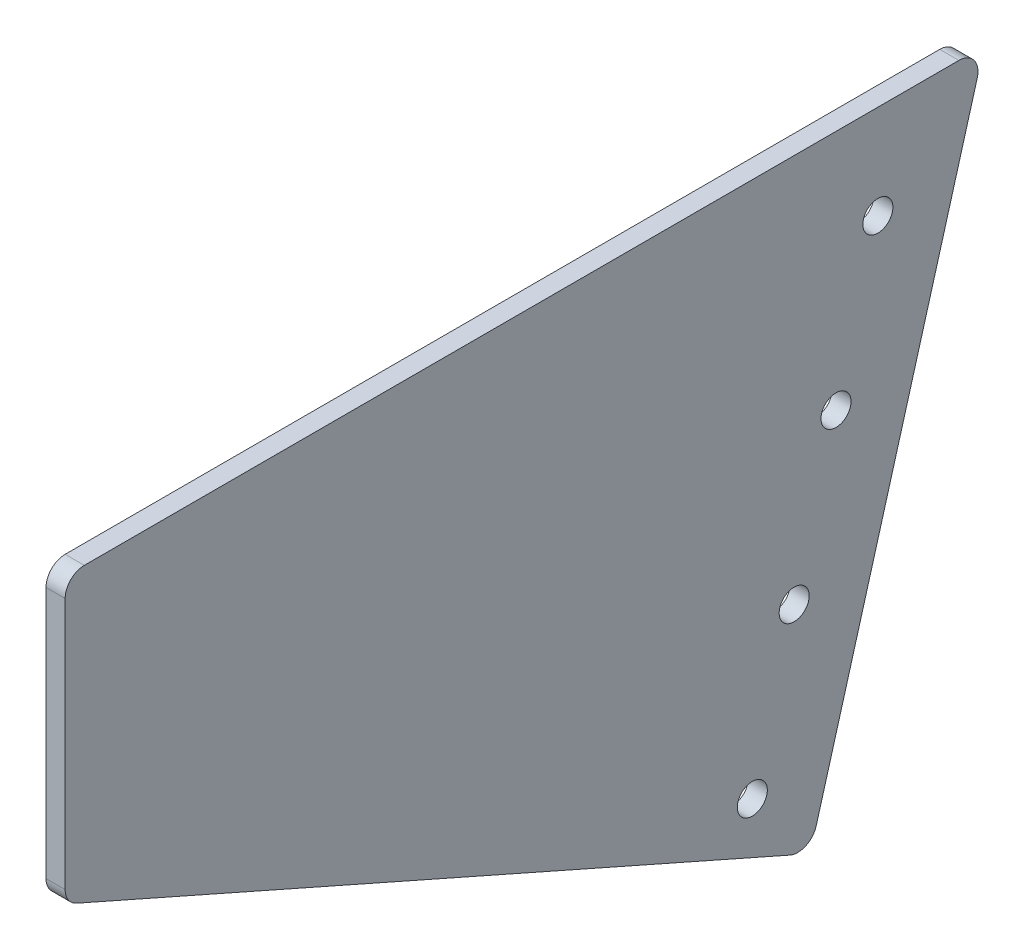
ISO-10303-21;
HEADER;
FILE_DESCRIPTION(('STEP AP214'),'2;1');
FILE_NAME('part.step','',(''),(''),'','','');
FILE_SCHEMA(('AUTOMOTIVE_DESIGN { 1 0 10303 214 1 1 1 1 }'));
ENDSEC;
DATA;
#1=APPLICATION_CONTEXT('core data for automotive mechanical design processes');
#2=APPLICATION_PROTOCOL_DEFINITION('international standard','automotive_design',2000,#1);
#3=PRODUCT_CONTEXT('',#1,'mechanical');
#4=PRODUCT('Part','Part','',(#3));
#5=PRODUCT_RELATED_PRODUCT_CATEGORY('part','',(#4));
#6=PRODUCT_DEFINITION_FORMATION('','',#4);
#7=PRODUCT_DEFINITION_CONTEXT('part definition',#1,'design');
#8=PRODUCT_DEFINITION('design','',#6,#7);
#9=PRODUCT_DEFINITION_SHAPE('','',#8);
#10=(LENGTH_UNIT() NAMED_UNIT(*) SI_UNIT(.MILLI.,.METRE.));
#11=(NAMED_UNIT(*) PLANE_ANGLE_UNIT() SI_UNIT($,.RADIAN.));
#12=(NAMED_UNIT(*) SI_UNIT($,.STERADIAN.) SOLID_ANGLE_UNIT());
#13=UNCERTAINTY_MEASURE_WITH_UNIT(LENGTH_MEASURE(1.E-05),#10,'distance_accuracy_value','');
#14=(GEOMETRIC_REPRESENTATION_CONTEXT(3) GLOBAL_UNCERTAINTY_ASSIGNED_CONTEXT((#13)) GLOBAL_UNIT_ASSIGNED_CONTEXT((#10,
#11,#12)) REPRESENTATION_CONTEXT('',''));
#15=CARTESIAN_POINT('',(0.,0.,0.));
#16=DIRECTION('',(0.,0.,1.));
#17=DIRECTION('',(1.,0.,0.));
#18=AXIS2_PLACEMENT_3D('',#15,#16,#17);
#19=CARTESIAN_POINT('',(3.175,0.,0.));
#20=DIRECTION('',(-1.,0.,0.));
#21=DIRECTION('',(0.,0.,1.));
#22=AXIS2_PLACEMENT_3D('',#19,#20,#21);
#23=PLANE('',#22);
#24=DIRECTION('',(0.,-0.403945829046919,-0.914782907140048));
#25=VECTOR('',#24,1.);
#26=CARTESIAN_POINT('',(3.175,252.697139878988,256.767993009252));
#27=LINE('',#26,#25);
#28=CARTESIAN_POINT('',(3.175,251.861470386146,254.875521016476));
#29=VERTEX_POINT('',#28);
#30=CARTESIAN_POINT('',(3.175,199.617122937856,136.562042812866));
#31=VERTEX_POINT('',#30);
#32=EDGE_CURVE('E144',#29,#31,#27,.T.);
#33=ORIENTED_EDGE('',*,*,#32,.T.);
#34=CARTESIAN_POINT('',(3.175,202.521558668026,135.279514805642));
#35=DIRECTION('',(-1.,0.,0.));
#36=DIRECTION('',(0.,0.,1.));
#37=AXIS2_PLACEMENT_3D('',#34,#35,#36);
#38=CIRCLE('',#37,3.175);
#39=CARTESIAN_POINT('',(3.175,201.654154713459,132.225298804833));
#40=VERTEX_POINT('',#39);
#41=EDGE_CURVE('E162',#31,#40,#38,.F.);
#42=ORIENTED_EDGE('',*,*,#41,.T.);
#43=DIRECTION('',(0.,0.96195779553062,-0.273198095926508));
#44=VECTOR('',#43,1.);
#45=CARTESIAN_POINT('',(3.175,198.142512107239,133.222612905359));
#46=LINE('',#45,#44);
#47=CARTESIAN_POINT('',(3.175,295.700108152673,105.516044481452));
#48=VERTEX_POINT('',#47);
#49=EDGE_CURVE('E126',#40,#48,#46,.T.);
#50=ORIENTED_EDGE('',*,*,#49,.T.);
#51=CARTESIAN_POINT('',(3.175,296.567512107239,108.570260482261));
#52=DIRECTION('',(-1.,0.,0.));
#53=DIRECTION('',(0.,0.,1.));
#54=AXIS2_PLACEMENT_3D('',#51,#52,#53);
#55=CIRCLE('',#54,3.175);
#56=CARTESIAN_POINT('',(3.175,299.742512107239,108.570260482261));
#57=VERTEX_POINT('',#56);
#58=EDGE_CURVE('E158',#48,#57,#55,.F.);
#59=ORIENTED_EDGE('',*,*,#58,.T.);
#60=DIRECTION('',(0.,0.,1.));
#61=VECTOR('',#60,1.);
#62=CARTESIAN_POINT('',(3.175,299.742512107239,104.367993009252));
#63=LINE('',#62,#61);
#64=CARTESIAN_POINT('',(3.175,299.742512107239,253.592993009252));
#65=VERTEX_POINT('',#64);
#66=EDGE_CURVE('E171',#57,#65,#63,.T.);
#67=ORIENTED_EDGE('',*,*,#66,.T.);
#68=CARTESIAN_POINT('',(3.175,296.567512107239,253.592993009252));
#69=DIRECTION('',(-1.,0.,0.));
#70=DIRECTION('',(0.,0.,1.));
#71=AXIS2_PLACEMENT_3D('',#68,#69,#70);
#72=CIRCLE('',#71,3.175);
#73=CARTESIAN_POINT('',(3.175,296.567512107239,256.767993009252));
#74=VERTEX_POINT('',#73);
#75=EDGE_CURVE('E61',#65,#74,#72,.F.);
#76=ORIENTED_EDGE('',*,*,#75,.T.);
#77=DIRECTION('',(0.,-1.,0.));
#78=VECTOR('',#77,1.);
#79=CARTESIAN_POINT('',(3.175,299.742512107239,256.767993009252));
#80=LINE('',#79,#78);
#81=CARTESIAN_POINT('',(3.175,254.765906116316,256.767993009252));
#82=VERTEX_POINT('',#81);
#83=EDGE_CURVE('E177',#74,#82,#80,.T.);
#84=ORIENTED_EDGE('',*,*,#83,.T.);
#85=CARTESIAN_POINT('',(3.175,254.765906116316,253.592993009252));
#86=DIRECTION('',(-1.,0.,0.));
#87=DIRECTION('',(0.,0.,1.));
#88=AXIS2_PLACEMENT_3D('',#85,#86,#87);
#89=CIRCLE('',#88,3.175);
#90=EDGE_CURVE('E160',#82,#29,#89,.F.);
#91=ORIENTED_EDGE('',*,*,#90,.T.);
#92=EDGE_LOOP('',(#33,#42,#50,#59,#67,#76,#84,#91));
#93=FACE_BOUND('',#92,.T.);
#94=CARTESIAN_POINT('',(3.175,284.143696126672,122.000332913772));
#95=DIRECTION('',(1.,0.,0.));
#96=DIRECTION('',(0.,0.,-1.));
#97=AXIS2_PLACEMENT_3D('',#94,#95,#96);
#98=CIRCLE('',#97,2.48920000000006);
#99=CARTESIAN_POINT('',(3.175,284.143696126672,119.511132913772));
#100=VERTEX_POINT('',#99);
#101=EDGE_CURVE('E135',#100,#100,#98,.T.);
#102=ORIENTED_EDGE('',*,*,#101,.F.);
#103=EDGE_LOOP('',(#102));
#104=FACE_BOUND('',#103,.T.);
#105=CARTESIAN_POINT('',(3.175,259.709968120195,128.939564550305));
#106=DIRECTION('',(1.,0.,0.));
#107=DIRECTION('',(0.,0.,-1.));
#108=AXIS2_PLACEMENT_3D('',#105,#106,#107);
#109=CIRCLE('',#108,2.48920000000009);
#110=CARTESIAN_POINT('',(3.175,259.709968120195,126.450364550305));
#111=VERTEX_POINT('',#110);
#112=EDGE_CURVE('E192',#111,#111,#109,.T.);
#113=ORIENTED_EDGE('',*,*,#112,.F.);
#114=EDGE_LOOP('',(#113));
#115=FACE_BOUND('',#114,.T.);
#116=CARTESIAN_POINT('',(3.175,235.276240113717,135.878796186838));
#117=DIRECTION('',(1.,0.,0.));
#118=DIRECTION('',(0.,0.,-1.));
#119=AXIS2_PLACEMENT_3D('',#116,#117,#118);
#120=CIRCLE('',#119,2.48920000000009);
#121=CARTESIAN_POINT('',(3.175,235.276240113717,133.389596186838));
#122=VERTEX_POINT('',#121);
#123=EDGE_CURVE('E197',#122,#122,#120,.T.);
#124=ORIENTED_EDGE('',*,*,#123,.F.);
#125=EDGE_LOOP('',(#124));
#126=FACE_BOUND('',#125,.T.);
#127=CARTESIAN_POINT('',(3.175,210.842512107239,142.818027823372));
#128=DIRECTION('',(1.,0.,0.));
#129=DIRECTION('',(0.,0.,-1.));
#130=AXIS2_PLACEMENT_3D('',#127,#128,#129);
#131=CIRCLE('',#130,2.48920000000006);
#132=CARTESIAN_POINT('',(3.175,210.842512107239,140.328827823372));
#133=VERTEX_POINT('',#132);
#134=EDGE_CURVE('E203',#133,#133,#131,.T.);
#135=ORIENTED_EDGE('',*,*,#134,.F.);
#136=EDGE_LOOP('',(#135));
#137=FACE_BOUND('',#136,.T.);
#138=ADVANCED_FACE('F39',(#93,#104,#115,#126,#137),#23,.F.);
#139=CARTESIAN_POINT('',(0.,0.,0.));
#140=DIRECTION('',(-1.,0.,0.));
#141=DIRECTION('',(0.,0.,1.));
#142=AXIS2_PLACEMENT_3D('',#139,#140,#141);
#143=PLANE('',#142);
#144=CARTESIAN_POINT('',(0.,235.276240113717,135.878796186838));
#145=DIRECTION('',(1.,0.,0.));
#146=DIRECTION('',(0.,0.,-1.));
#147=AXIS2_PLACEMENT_3D('',#144,#145,#146);
#148=CIRCLE('',#147,2.48920000000009);
#149=CARTESIAN_POINT('',(0.,235.276240113717,133.389596186838));
#150=VERTEX_POINT('',#149);
#151=EDGE_CURVE('E200',#150,#150,#148,.T.);
#152=ORIENTED_EDGE('',*,*,#151,.T.);
#153=EDGE_LOOP('',(#152));
#154=FACE_BOUND('',#153,.T.);
#155=CARTESIAN_POINT('',(0.,284.143696126672,122.000332913772));
#156=DIRECTION('',(1.,0.,0.));
#157=DIRECTION('',(0.,0.,-1.));
#158=AXIS2_PLACEMENT_3D('',#155,#156,#157);
#159=CIRCLE('',#158,2.48920000000006);
#160=CARTESIAN_POINT('',(0.,284.143696126672,119.511132913772));
#161=VERTEX_POINT('',#160);
#162=EDGE_CURVE('E141',#161,#161,#159,.T.);
#163=ORIENTED_EDGE('',*,*,#162,.T.);
#164=EDGE_LOOP('',(#163));
#165=FACE_BOUND('',#164,.T.);
#166=DIRECTION('',(0.,0.96195779553062,-0.273198095926508));
#167=VECTOR('',#166,1.);
#168=CARTESIAN_POINT('',(0.,198.142512107239,133.222612905359));
#169=LINE('',#168,#167);
#170=CARTESIAN_POINT('',(0.,201.654154713459,132.225298804833));
#171=VERTEX_POINT('',#170);
#172=CARTESIAN_POINT('',(0.,295.700108152673,105.516044481452));
#173=VERTEX_POINT('',#172);
#174=EDGE_CURVE('E123',#171,#173,#169,.T.);
#175=ORIENTED_EDGE('',*,*,#174,.F.);
#176=CARTESIAN_POINT('',(0.,202.521558668026,135.279514805642));
#177=DIRECTION('',(-1.,0.,0.));
#178=DIRECTION('',(0.,0.,1.));
#179=AXIS2_PLACEMENT_3D('',#176,#177,#178);
#180=CIRCLE('',#179,3.175);
#181=CARTESIAN_POINT('',(0.,199.617122937856,136.562042812866));
#182=VERTEX_POINT('',#181);
#183=EDGE_CURVE('E106',#171,#182,#180,.T.);
#184=ORIENTED_EDGE('',*,*,#183,.T.);
#185=DIRECTION('',(0.,-0.403945829046919,-0.914782907140048));
#186=VECTOR('',#185,1.);
#187=CARTESIAN_POINT('',(0.,252.697139878988,256.767993009252));
#188=LINE('',#187,#186);
#189=CARTESIAN_POINT('',(0.,251.861470386146,254.875521016476));
#190=VERTEX_POINT('',#189);
#191=EDGE_CURVE('E148',#190,#182,#188,.T.);
#192=ORIENTED_EDGE('',*,*,#191,.F.);
#193=CARTESIAN_POINT('',(0.,254.765906116316,253.592993009252));
#194=DIRECTION('',(-1.,0.,0.));
#195=DIRECTION('',(0.,0.,1.));
#196=AXIS2_PLACEMENT_3D('',#193,#194,#195);
#197=CIRCLE('',#196,3.175);
#198=CARTESIAN_POINT('',(0.,254.765906116316,256.767993009252));
#199=VERTEX_POINT('',#198);
#200=EDGE_CURVE('E117',#190,#199,#197,.T.);
#201=ORIENTED_EDGE('',*,*,#200,.T.);
#202=DIRECTION('',(0.,-1.,0.));
#203=VECTOR('',#202,1.);
#204=CARTESIAN_POINT('',(0.,299.742512107239,256.767993009252));
#205=LINE('',#204,#203);
#206=CARTESIAN_POINT('',(0.,296.567512107239,256.767993009252));
#207=VERTEX_POINT('',#206);
#208=EDGE_CURVE('E138',#207,#199,#205,.T.);
#209=ORIENTED_EDGE('',*,*,#208,.F.);
#210=CARTESIAN_POINT('',(0.,296.567512107239,253.592993009252));
#211=DIRECTION('',(-1.,0.,0.));
#212=DIRECTION('',(0.,0.,1.));
#213=AXIS2_PLACEMENT_3D('',#210,#211,#212);
#214=CIRCLE('',#213,3.175);
#215=CARTESIAN_POINT('',(0.,299.742512107239,253.592993009252));
#216=VERTEX_POINT('',#215);
#217=EDGE_CURVE('E127',#207,#216,#214,.T.);
#218=ORIENTED_EDGE('',*,*,#217,.T.);
#219=DIRECTION('',(0.,0.,1.));
#220=VECTOR('',#219,1.);
#221=CARTESIAN_POINT('',(0.,299.742512107239,104.367993009252));
#222=LINE('',#221,#220);
#223=CARTESIAN_POINT('',(0.,299.742512107239,108.570260482261));
#224=VERTEX_POINT('',#223);
#225=EDGE_CURVE('E134',#224,#216,#222,.T.);
#226=ORIENTED_EDGE('',*,*,#225,.F.);
#227=CARTESIAN_POINT('',(0.,296.567512107239,108.570260482261));
#228=DIRECTION('',(-1.,0.,0.));
#229=DIRECTION('',(0.,0.,1.));
#230=AXIS2_PLACEMENT_3D('',#227,#228,#229);
#231=CIRCLE('',#230,3.175);
#232=EDGE_CURVE('E133',#224,#173,#231,.T.);
#233=ORIENTED_EDGE('',*,*,#232,.T.);
#234=EDGE_LOOP('',(#175,#184,#192,#201,#209,#218,#226,#233));
#235=FACE_BOUND('',#234,.T.);
#236=CARTESIAN_POINT('',(0.,259.709968120195,128.939564550305));
#237=DIRECTION('',(1.,0.,0.));
#238=DIRECTION('',(0.,0.,-1.));
#239=AXIS2_PLACEMENT_3D('',#236,#237,#238);
#240=CIRCLE('',#239,2.48920000000009);
#241=CARTESIAN_POINT('',(0.,259.709968120195,126.450364550305));
#242=VERTEX_POINT('',#241);
#243=EDGE_CURVE('E194',#242,#242,#240,.T.);
#244=ORIENTED_EDGE('',*,*,#243,.T.);
#245=EDGE_LOOP('',(#244));
#246=FACE_BOUND('',#245,.T.);
#247=CARTESIAN_POINT('',(0.,210.842512107239,142.818027823372));
#248=DIRECTION('',(1.,0.,0.));
#249=DIRECTION('',(0.,0.,-1.));
#250=AXIS2_PLACEMENT_3D('',#247,#248,#249);
#251=CIRCLE('',#250,2.48920000000006);
#252=CARTESIAN_POINT('',(0.,210.842512107239,140.328827823372));
#253=VERTEX_POINT('',#252);
#254=EDGE_CURVE('E206',#253,#253,#251,.T.);
#255=ORIENTED_EDGE('',*,*,#254,.T.);
#256=EDGE_LOOP('',(#255));
#257=FACE_BOUND('',#256,.T.);
#258=ADVANCED_FACE('F130',(#154,#165,#235,#246,#257),#143,.T.);
#259=CARTESIAN_POINT('',(3.175,198.142512107239,133.222612905359));
#260=DIRECTION('',(0.,0.273198095926508,0.96195779553062));
#261=DIRECTION('',(0.,-0.96195779553062,0.273198095926508));
#262=AXIS2_PLACEMENT_3D('',#259,#260,#261);
#263=PLANE('',#262);
#264=ORIENTED_EDGE('',*,*,#49,.F.);
#265=DIRECTION('',(-1.,0.,0.));
#266=VECTOR('',#265,1.);
#267=CARTESIAN_POINT('',(3.175,201.654154713459,132.225298804833));
#268=LINE('',#267,#266);
#269=EDGE_CURVE('E110',#40,#171,#268,.T.);
#270=ORIENTED_EDGE('',*,*,#269,.T.);
#271=ORIENTED_EDGE('',*,*,#174,.T.);
#272=DIRECTION('',(-1.,0.,0.));
#273=VECTOR('',#272,1.);
#274=CARTESIAN_POINT('',(3.175,295.700108152673,105.516044481452));
#275=LINE('',#274,#273);
#276=EDGE_CURVE('E128',#173,#48,#275,.F.);
#277=ORIENTED_EDGE('',*,*,#276,.T.);
#278=EDGE_LOOP('',(#264,#270,#271,#277));
#279=FACE_BOUND('',#278,.T.);
#280=ADVANCED_FACE('F122',(#279),#263,.F.);
#281=CARTESIAN_POINT('',(3.175,299.742512107239,104.367993009252));
#282=DIRECTION('',(0.,-1.,0.));
#283=DIRECTION('',(0.,0.,-1.));
#284=AXIS2_PLACEMENT_3D('',#281,#282,#283);
#285=PLANE('',#284);
#286=ORIENTED_EDGE('',*,*,#66,.F.);
#287=DIRECTION('',(-1.,0.,0.));
#288=VECTOR('',#287,1.);
#289=CARTESIAN_POINT('',(3.175,299.742512107239,108.570260482261));
#290=LINE('',#289,#288);
#291=EDGE_CURVE('E11',#57,#224,#290,.T.);
#292=ORIENTED_EDGE('',*,*,#291,.T.);
#293=ORIENTED_EDGE('',*,*,#225,.T.);
#294=DIRECTION('',(-1.,0.,0.));
#295=VECTOR('',#294,1.);
#296=CARTESIAN_POINT('',(3.175,299.742512107239,253.592993009252));
#297=LINE('',#296,#295);
#298=EDGE_CURVE('E47',#216,#65,#297,.F.);
#299=ORIENTED_EDGE('',*,*,#298,.T.);
#300=EDGE_LOOP('',(#286,#292,#293,#299));
#301=FACE_BOUND('',#300,.T.);
#302=ADVANCED_FACE('F170',(#301),#285,.F.);
#303=CARTESIAN_POINT('',(3.175,299.742512107239,256.767993009252));
#304=DIRECTION('',(0.,0.,-1.));
#305=DIRECTION('',(-1.,0.,0.));
#306=AXIS2_PLACEMENT_3D('',#303,#304,#305);
#307=PLANE('',#306);
#308=ORIENTED_EDGE('',*,*,#208,.T.);
#309=DIRECTION('',(-1.,0.,0.));
#310=VECTOR('',#309,1.);
#311=CARTESIAN_POINT('',(3.175,254.765906116316,256.767993009252));
#312=LINE('',#311,#310);
#313=EDGE_CURVE('E54',#199,#82,#312,.F.);
#314=ORIENTED_EDGE('',*,*,#313,.T.);
#315=ORIENTED_EDGE('',*,*,#83,.F.);
#316=DIRECTION('',(-1.,0.,0.));
#317=VECTOR('',#316,1.);
#318=CARTESIAN_POINT('',(3.175,296.567512107239,256.767993009252));
#319=LINE('',#318,#317);
#320=EDGE_CURVE('E164',#74,#207,#319,.T.);
#321=ORIENTED_EDGE('',*,*,#320,.T.);
#322=EDGE_LOOP('',(#308,#314,#315,#321));
#323=FACE_BOUND('',#322,.T.);
#324=ADVANCED_FACE('F181',(#323),#307,.F.);
#325=CARTESIAN_POINT('',(3.175,252.697139878988,256.767993009252));
#326=DIRECTION('',(0.,0.914782907140048,-0.403945829046919));
#327=DIRECTION('',(0.,0.403945829046919,0.914782907140048));
#328=AXIS2_PLACEMENT_3D('',#325,#326,#327);
#329=PLANE('',#328);
#330=ORIENTED_EDGE('',*,*,#191,.T.);
#331=DIRECTION('',(-1.,0.,0.));
#332=VECTOR('',#331,1.);
#333=CARTESIAN_POINT('',(3.175,199.617122937856,136.562042812866));
#334=LINE('',#333,#332);
#335=EDGE_CURVE('E111',#182,#31,#334,.F.);
#336=ORIENTED_EDGE('',*,*,#335,.T.);
#337=ORIENTED_EDGE('',*,*,#32,.F.);
#338=DIRECTION('',(-1.,0.,0.));
#339=VECTOR('',#338,1.);
#340=CARTESIAN_POINT('',(3.175,251.861470386146,254.875521016476));
#341=LINE('',#340,#339);
#342=EDGE_CURVE('E116',#29,#190,#341,.T.);
#343=ORIENTED_EDGE('',*,*,#342,.T.);
#344=EDGE_LOOP('',(#330,#336,#337,#343));
#345=FACE_BOUND('',#344,.T.);
#346=ADVANCED_FACE('F188',(#345),#329,.F.);
#347=CARTESIAN_POINT('',(3.175,284.143696126672,122.000332913772));
#348=DIRECTION('',(-1.,0.,0.));
#349=DIRECTION('',(0.,0.,1.));
#350=AXIS2_PLACEMENT_3D('',#347,#348,#349);
#351=CYLINDRICAL_SURFACE('',#350,2.48920000000006);
#352=ORIENTED_EDGE('',*,*,#101,.T.);
#353=EDGE_LOOP('',(#352));
#354=FACE_BOUND('',#353,.T.);
#355=ORIENTED_EDGE('',*,*,#162,.F.);
#356=EDGE_LOOP('',(#355));
#357=FACE_BOUND('',#356,.T.);
#358=ADVANCED_FACE('F224',(#354,#357),#351,.F.);
#359=CARTESIAN_POINT('',(3.175,259.709968120195,128.939564550305));
#360=DIRECTION('',(-1.,0.,0.));
#361=DIRECTION('',(0.,0.,1.));
#362=AXIS2_PLACEMENT_3D('',#359,#360,#361);
#363=CYLINDRICAL_SURFACE('',#362,2.48920000000009);
#364=ORIENTED_EDGE('',*,*,#112,.T.);
#365=EDGE_LOOP('',(#364));
#366=FACE_BOUND('',#365,.T.);
#367=ORIENTED_EDGE('',*,*,#243,.F.);
#368=EDGE_LOOP('',(#367));
#369=FACE_BOUND('',#368,.T.);
#370=ADVANCED_FACE('F280',(#366,#369),#363,.F.);
#371=CARTESIAN_POINT('',(3.175,235.276240113717,135.878796186838));
#372=DIRECTION('',(-1.,0.,0.));
#373=DIRECTION('',(0.,0.,1.));
#374=AXIS2_PLACEMENT_3D('',#371,#372,#373);
#375=CYLINDRICAL_SURFACE('',#374,2.48920000000009);
#376=ORIENTED_EDGE('',*,*,#123,.T.);
#377=EDGE_LOOP('',(#376));
#378=FACE_BOUND('',#377,.T.);
#379=ORIENTED_EDGE('',*,*,#151,.F.);
#380=EDGE_LOOP('',(#379));
#381=FACE_BOUND('',#380,.T.);
#382=ADVANCED_FACE('F271',(#378,#381),#375,.F.);
#383=CARTESIAN_POINT('',(3.175,210.842512107239,142.818027823372));
#384=DIRECTION('',(-1.,0.,0.));
#385=DIRECTION('',(0.,0.,1.));
#386=AXIS2_PLACEMENT_3D('',#383,#384,#385);
#387=CYLINDRICAL_SURFACE('',#386,2.48920000000006);
#388=ORIENTED_EDGE('',*,*,#134,.T.);
#389=EDGE_LOOP('',(#388));
#390=FACE_BOUND('',#389,.T.);
#391=ORIENTED_EDGE('',*,*,#254,.F.);
#392=EDGE_LOOP('',(#391));
#393=FACE_BOUND('',#392,.T.);
#394=ADVANCED_FACE('F212',(#390,#393),#387,.F.);
#395=CARTESIAN_POINT('',(3.175,202.521558668026,135.279514805642));
#396=DIRECTION('',(-1.,0.,0.));
#397=DIRECTION('',(0.,0.,1.));
#398=AXIS2_PLACEMENT_3D('',#395,#396,#397);
#399=CYLINDRICAL_SURFACE('',#398,3.175);
#400=ORIENTED_EDGE('',*,*,#41,.F.);
#401=ORIENTED_EDGE('',*,*,#335,.F.);
#402=ORIENTED_EDGE('',*,*,#183,.F.);
#403=ORIENTED_EDGE('',*,*,#269,.F.);
#404=EDGE_LOOP('',(#400,#401,#402,#403));
#405=FACE_BOUND('',#404,.T.);
#406=ADVANCED_FACE('F109',(#405),#399,.T.);
#407=CARTESIAN_POINT('',(3.175,254.765906116316,253.592993009252));
#408=DIRECTION('',(-1.,0.,0.));
#409=DIRECTION('',(0.,0.,1.));
#410=AXIS2_PLACEMENT_3D('',#407,#408,#409);
#411=CYLINDRICAL_SURFACE('',#410,3.175);
#412=ORIENTED_EDGE('',*,*,#90,.F.);
#413=ORIENTED_EDGE('',*,*,#313,.F.);
#414=ORIENTED_EDGE('',*,*,#200,.F.);
#415=ORIENTED_EDGE('',*,*,#342,.F.);
#416=EDGE_LOOP('',(#412,#413,#414,#415));
#417=FACE_BOUND('',#416,.T.);
#418=ADVANCED_FACE('F185',(#417),#411,.T.);
#419=CARTESIAN_POINT('',(3.175,296.567512107239,108.570260482261));
#420=DIRECTION('',(-1.,0.,0.));
#421=DIRECTION('',(0.,0.,1.));
#422=AXIS2_PLACEMENT_3D('',#419,#420,#421);
#423=CYLINDRICAL_SURFACE('',#422,3.175);
#424=ORIENTED_EDGE('',*,*,#58,.F.);
#425=ORIENTED_EDGE('',*,*,#276,.F.);
#426=ORIENTED_EDGE('',*,*,#232,.F.);
#427=ORIENTED_EDGE('',*,*,#291,.F.);
#428=EDGE_LOOP('',(#424,#425,#426,#427));
#429=FACE_BOUND('',#428,.T.);
#430=ADVANCED_FACE('F238',(#429),#423,.T.);
#431=CARTESIAN_POINT('',(3.175,296.567512107239,253.592993009252));
#432=DIRECTION('',(-1.,0.,0.));
#433=DIRECTION('',(0.,0.,1.));
#434=AXIS2_PLACEMENT_3D('',#431,#432,#433);
#435=CYLINDRICAL_SURFACE('',#434,3.175);
#436=ORIENTED_EDGE('',*,*,#75,.F.);
#437=ORIENTED_EDGE('',*,*,#298,.F.);
#438=ORIENTED_EDGE('',*,*,#217,.F.);
#439=ORIENTED_EDGE('',*,*,#320,.F.);
#440=EDGE_LOOP('',(#436,#437,#438,#439));
#441=FACE_BOUND('',#440,.T.);
#442=ADVANCED_FACE('F41',(#441),#435,.T.);
#443=CLOSED_SHELL('',(#138,#258,#280,#302,#324,#346,#358,#370,#382,#394,#406,#418,#430,#442));
#444=MANIFOLD_SOLID_BREP('B2',#443);
#445=ADVANCED_BREP_SHAPE_REPRESENTATION('',(#18,#444),#14);
#446=SHAPE_DEFINITION_REPRESENTATION(#9,#445);
ENDSEC;
END-ISO-10303-21;
